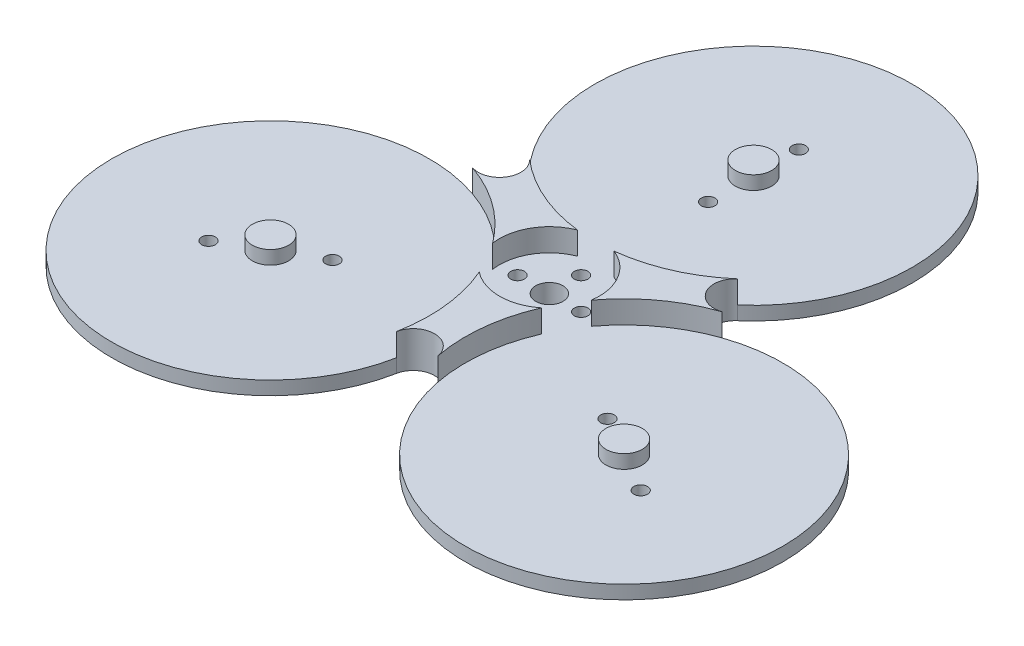
ISO-10303-21;
HEADER;
FILE_DESCRIPTION(('STEP AP214'),'2;1');
FILE_NAME('part.step','',(''),(''),'','','');
FILE_SCHEMA(('AUTOMOTIVE_DESIGN { 1 0 10303 214 1 1 1 1 }'));
ENDSEC;
DATA;
#1=APPLICATION_CONTEXT('core data for automotive mechanical design processes');
#2=APPLICATION_PROTOCOL_DEFINITION('international standard','automotive_design',2000,#1);
#3=PRODUCT_CONTEXT('',#1,'mechanical');
#4=PRODUCT('Part','Part','',(#3));
#5=PRODUCT_RELATED_PRODUCT_CATEGORY('part','',(#4));
#6=PRODUCT_DEFINITION_FORMATION('','',#4);
#7=PRODUCT_DEFINITION_CONTEXT('part definition',#1,'design');
#8=PRODUCT_DEFINITION('design','',#6,#7);
#9=PRODUCT_DEFINITION_SHAPE('','',#8);
#10=(LENGTH_UNIT() NAMED_UNIT(*) SI_UNIT(.MILLI.,.METRE.));
#11=(NAMED_UNIT(*) PLANE_ANGLE_UNIT() SI_UNIT($,.RADIAN.));
#12=(NAMED_UNIT(*) SI_UNIT($,.STERADIAN.) SOLID_ANGLE_UNIT());
#13=UNCERTAINTY_MEASURE_WITH_UNIT(LENGTH_MEASURE(1.E-05),#10,'distance_accuracy_value','');
#14=(GEOMETRIC_REPRESENTATION_CONTEXT(3) GLOBAL_UNCERTAINTY_ASSIGNED_CONTEXT((#13)) GLOBAL_UNIT_ASSIGNED_CONTEXT((#10,
#11,#12)) REPRESENTATION_CONTEXT('',''));
#15=CARTESIAN_POINT('',(0.,0.,0.));
#16=DIRECTION('',(0.,0.,1.));
#17=DIRECTION('',(1.,0.,0.));
#18=AXIS2_PLACEMENT_3D('',#15,#16,#17);
#19=CARTESIAN_POINT('',(5.759281940243E-13,3.,-44.9999999999999));
#20=DIRECTION('',(0.,1.,0.));
#21=DIRECTION('',(0.,0.,1.));
#22=AXIS2_PLACEMENT_3D('',#19,#20,#21);
#23=CYLINDRICAL_SURFACE('',#22,4.);
#24=CARTESIAN_POINT('',(5.759281940243E-13,3.,-44.9999999999999));
#25=DIRECTION('',(0.,1.,0.));
#26=DIRECTION('',(0.,0.,1.));
#27=AXIS2_PLACEMENT_3D('',#24,#25,#26);
#28=CIRCLE('',#27,4.);
#29=CARTESIAN_POINT('',(5.759281940243E-13,3.,-40.9999999999999));
#30=VERTEX_POINT('',#29);
#31=EDGE_CURVE('E240',#30,#30,#28,.T.);
#32=ORIENTED_EDGE('',*,*,#31,.T.);
#33=EDGE_LOOP('',(#32));
#34=FACE_BOUND('',#33,.T.);
#35=CARTESIAN_POINT('',(5.759281940243E-13,6.,-44.9999999999999));
#36=DIRECTION('',(0.,1.,0.));
#37=DIRECTION('',(0.,0.,1.));
#38=AXIS2_PLACEMENT_3D('',#35,#36,#37);
#39=CIRCLE('',#38,4.);
#40=CARTESIAN_POINT('',(5.759281940243E-13,6.,-40.9999999999999));
#41=VERTEX_POINT('',#40);
#42=EDGE_CURVE('E249',#41,#41,#39,.T.);
#43=ORIENTED_EDGE('',*,*,#42,.F.);
#44=EDGE_LOOP('',(#43));
#45=FACE_BOUND('',#44,.T.);
#46=ADVANCED_FACE('F99',(#34,#45),#23,.T.);
#47=CARTESIAN_POINT('',(38.9711431703026,3.,22.4999999999983));
#48=DIRECTION('',(0.,1.,0.));
#49=DIRECTION('',(0.,0.,1.));
#50=AXIS2_PLACEMENT_3D('',#47,#48,#49);
#51=CYLINDRICAL_SURFACE('',#50,4.00000000000301);
#52=CARTESIAN_POINT('',(38.9711431703026,3.,22.4999999999983));
#53=DIRECTION('',(0.,1.,0.));
#54=DIRECTION('',(0.,0.,1.));
#55=AXIS2_PLACEMENT_3D('',#52,#53,#54);
#56=CIRCLE('',#55,4.00000000000301);
#57=CARTESIAN_POINT('',(38.9711431703026,3.,26.5000000000013));
#58=VERTEX_POINT('',#57);
#59=EDGE_CURVE('E318',#58,#58,#56,.T.);
#60=ORIENTED_EDGE('',*,*,#59,.T.);
#61=EDGE_LOOP('',(#60));
#62=FACE_BOUND('',#61,.T.);
#63=CARTESIAN_POINT('',(38.9711431703026,6.,22.4999999999983));
#64=DIRECTION('',(0.,1.,0.));
#65=DIRECTION('',(0.,0.,1.));
#66=AXIS2_PLACEMENT_3D('',#63,#64,#65);
#67=CIRCLE('',#66,4.00000000000301);
#68=CARTESIAN_POINT('',(38.9711431703026,6.,26.5000000000013));
#69=VERTEX_POINT('',#68);
#70=EDGE_CURVE('E252',#69,#69,#67,.T.);
#71=ORIENTED_EDGE('',*,*,#70,.F.);
#72=EDGE_LOOP('',(#71));
#73=FACE_BOUND('',#72,.T.);
#74=ADVANCED_FACE('F354',(#62,#73),#51,.T.);
#75=CARTESIAN_POINT('',(-38.9711431702969,3.,22.5000000000017));
#76=DIRECTION('',(0.,1.,0.));
#77=DIRECTION('',(0.,0.,1.));
#78=AXIS2_PLACEMENT_3D('',#75,#76,#77);
#79=CYLINDRICAL_SURFACE('',#78,4.00000000000418);
#80=CARTESIAN_POINT('',(-38.9711431702969,3.,22.5000000000017));
#81=DIRECTION('',(0.,1.,0.));
#82=DIRECTION('',(0.,0.,1.));
#83=AXIS2_PLACEMENT_3D('',#80,#81,#82);
#84=CIRCLE('',#83,4.00000000000418);
#85=CARTESIAN_POINT('',(-38.9711431702969,3.,26.5000000000059));
#86=VERTEX_POINT('',#85);
#87=EDGE_CURVE('E286',#86,#86,#84,.T.);
#88=ORIENTED_EDGE('',*,*,#87,.T.);
#89=EDGE_LOOP('',(#88));
#90=FACE_BOUND('',#89,.T.);
#91=CARTESIAN_POINT('',(-38.9711431702969,6.,22.5000000000017));
#92=DIRECTION('',(0.,1.,0.));
#93=DIRECTION('',(0.,0.,1.));
#94=AXIS2_PLACEMENT_3D('',#91,#92,#93);
#95=CIRCLE('',#94,4.00000000000418);
#96=CARTESIAN_POINT('',(-38.9711431702969,6.,26.5000000000059));
#97=VERTEX_POINT('',#96);
#98=EDGE_CURVE('E255',#97,#97,#95,.T.);
#99=ORIENTED_EDGE('',*,*,#98,.F.);
#100=EDGE_LOOP('',(#99));
#101=FACE_BOUND('',#100,.T.);
#102=ADVANCED_FACE('F360',(#90,#101),#79,.T.);
#103=CARTESIAN_POINT('',(-12.9903810567665,8.,-30.));
#104=DIRECTION('',(0.,1.,0.));
#105=DIRECTION('',(0.,0.,1.));
#106=AXIS2_PLACEMENT_3D('',#103,#104,#105);
#107=PLANE('',#106);
#108=CARTESIAN_POINT('',(5.759281940243E-13,8.,-44.9999999999999));
#109=DIRECTION('',(0.,1.,0.));
#110=DIRECTION('',(0.,0.,1.));
#111=AXIS2_PLACEMENT_3D('',#108,#109,#110);
#112=CIRCLE('',#111,35.);
#113=CARTESIAN_POINT('',(-22.9128784747792,8.,-18.5424868893545));
#114=VERTEX_POINT('',#113);
#115=CARTESIAN_POINT('',(-4.03471050868448,8.,-10.2333333333333));
#116=VERTEX_POINT('',#115);
#117=EDGE_CURVE('E246',#114,#116,#112,.T.);
#118=ORIENTED_EDGE('',*,*,#117,.F.);
#119=CARTESIAN_POINT('',(-25.9807621135335,8.,-15.0000000000001));
#120=DIRECTION('',(0.,-1.,0.));
#121=DIRECTION('',(0.,0.,1.));
#122=AXIS2_PLACEMENT_3D('',#119,#120,#121);
#123=CIRCLE('',#122,4.68626966596892);
#124=CARTESIAN_POINT('',(-27.5147039329101,8.,-10.5718913883084));
#125=VERTEX_POINT('',#124);
#126=EDGE_CURVE('E462',#114,#125,#123,.T.);
#127=ORIENTED_EDGE('',*,*,#126,.T.);
#128=CARTESIAN_POINT('',(-38.9711431702997,8.,22.5));
#129=DIRECTION('',(0.,1.,0.));
#130=DIRECTION('',(0.,0.,1.));
#131=AXIS2_PLACEMENT_3D('',#128,#129,#130);
#132=CIRCLE('',#131,35.0000000000009);
#133=CARTESIAN_POINT('',(-10.8796818864033,8.,1.62250486922791));
#134=VERTEX_POINT('',#133);
#135=EDGE_CURVE('E281',#134,#125,#132,.T.);
#136=ORIENTED_EDGE('',*,*,#135,.F.);
#137=CARTESIAN_POINT('',(0.,8.,0.));
#138=DIRECTION('',(0.,1.,0.));
#139=DIRECTION('',(0.,0.,1.));
#140=AXIS2_PLACEMENT_3D('',#137,#138,#139);
#141=CIRCLE('',#140,11.);
#142=EDGE_CURVE('E257',#116,#134,#141,.T.);
#143=ORIENTED_EDGE('',*,*,#142,.F.);
#144=EDGE_LOOP('',(#118,#127,#136,#143));
#145=FACE_BOUND('',#144,.T.);
#146=ADVANCED_FACE('F380',(#145),#107,.T.);
#147=CARTESIAN_POINT('',(4.03471050868474,8.,-10.2333333333332));
#148=VERTEX_POINT('',#147);
#149=CARTESIAN_POINT('',(22.9128784747795,8.,-18.5424868893538));
#150=VERTEX_POINT('',#149);
#151=EDGE_CURVE('E243',#148,#150,#112,.T.);
#152=ORIENTED_EDGE('',*,*,#151,.F.);
#153=CARTESIAN_POINT('',(10.8796818864032,8.,1.62250486922836));
#154=VERTEX_POINT('',#153);
#155=EDGE_CURVE('E216',#154,#148,#141,.T.);
#156=ORIENTED_EDGE('',*,*,#155,.F.);
#157=CARTESIAN_POINT('',(38.9711431702998,8.,22.5));
#158=DIRECTION('',(0.,1.,0.));
#159=DIRECTION('',(0.,0.,1.));
#160=AXIS2_PLACEMENT_3D('',#157,#158,#159);
#161=CIRCLE('',#160,35.0000000000007);
#162=CARTESIAN_POINT('',(27.5147039329099,8.,-10.5718913883081));
#163=VERTEX_POINT('',#162);
#164=EDGE_CURVE('E292',#163,#154,#161,.T.);
#165=ORIENTED_EDGE('',*,*,#164,.F.);
#166=CARTESIAN_POINT('',(25.9807621135332,8.,-14.9999999999999));
#167=DIRECTION('',(0.,-1.,0.));
#168=DIRECTION('',(0.,0.,1.));
#169=AXIS2_PLACEMENT_3D('',#166,#167,#168);
#170=CIRCLE('',#169,4.68626966596894);
#171=EDGE_CURVE('E478',#163,#150,#170,.T.);
#172=ORIENTED_EDGE('',*,*,#171,.T.);
#173=EDGE_LOOP('',(#152,#156,#165,#172));
#174=FACE_BOUND('',#173,.T.);
#175=ADVANCED_FACE('F563',(#174),#107,.T.);
#176=CARTESIAN_POINT('',(-38.9711431702999,8.,22.4999999999997));
#177=DIRECTION('',(0.,-1.,0.));
#178=DIRECTION('',(0.,0.,-1.));
#179=AXIS2_PLACEMENT_3D('',#176,#177,#178);
#180=CYLINDRICAL_SURFACE('',#179,35.0000000000002);
#181=CARTESIAN_POINT('',(-38.9711431702997,3.,22.5));
#182=DIRECTION('',(0.,1.,0.));
#183=DIRECTION('',(0.,0.,1.));
#184=AXIS2_PLACEMENT_3D('',#181,#182,#183);
#185=CIRCLE('',#184,35.0000000000009);
#186=CARTESIAN_POINT('',(-27.5147039329101,3.,-10.5718913883084));
#187=VERTEX_POINT('',#186);
#188=CARTESIAN_POINT('',(-4.60182545813007,3.,29.114378277662));
#189=VERTEX_POINT('',#188);
#190=EDGE_CURVE('E305',#187,#189,#185,.T.);
#191=ORIENTED_EDGE('',*,*,#190,.F.);
#192=DIRECTION('',(0.,-1.,0.));
#193=VECTOR('',#192,1.);
#194=CARTESIAN_POINT('',(-27.5147039329108,8.,-10.5718913883064));
#195=LINE('',#194,#193);
#196=CARTESIAN_POINT('',(-27.5147039329108,0.,-10.5718913883064));
#197=VERTEX_POINT('',#196);
#198=EDGE_CURVE('E447',#187,#197,#195,.T.);
#199=ORIENTED_EDGE('',*,*,#198,.T.);
#200=CARTESIAN_POINT('',(-38.9711431702999,0.,22.4999999999997));
#201=DIRECTION('',(0.,1.,0.));
#202=DIRECTION('',(0.,0.,1.));
#203=AXIS2_PLACEMENT_3D('',#200,#201,#202);
#204=CIRCLE('',#203,35.0000000000002);
#205=CARTESIAN_POINT('',(-4.60182545813127,0.,29.1143782776618));
#206=VERTEX_POINT('',#205);
#207=EDGE_CURVE('E471',#197,#206,#204,.T.);
#208=ORIENTED_EDGE('',*,*,#207,.T.);
#209=DIRECTION('',(0.,-1.,0.));
#210=VECTOR('',#209,1.);
#211=CARTESIAN_POINT('',(-4.60182545813127,8.,29.1143782776618));
#212=LINE('',#211,#210);
#213=EDGE_CURVE('E451',#189,#206,#212,.T.);
#214=ORIENTED_EDGE('',*,*,#213,.F.);
#215=EDGE_LOOP('',(#191,#199,#208,#214));
#216=FACE_BOUND('',#215,.T.);
#217=ADVANCED_FACE('F576',(#216),#180,.T.);
#218=CARTESIAN_POINT('',(38.9711431702996,8.,22.5000000000002));
#219=DIRECTION('',(0.,-1.,0.));
#220=DIRECTION('',(0.,0.,-1.));
#221=AXIS2_PLACEMENT_3D('',#218,#219,#220);
#222=CYLINDRICAL_SURFACE('',#221,35.);
#223=CARTESIAN_POINT('',(38.9711431702998,3.,22.5));
#224=DIRECTION('',(0.,1.,0.));
#225=DIRECTION('',(0.,0.,1.));
#226=AXIS2_PLACEMENT_3D('',#223,#224,#225);
#227=CIRCLE('',#226,35.0000000000007);
#228=CARTESIAN_POINT('',(4.60182545813028,3.,29.1143782776619));
#229=VERTEX_POINT('',#228);
#230=CARTESIAN_POINT('',(27.5147039329099,3.,-10.5718913883081));
#231=VERTEX_POINT('',#230);
#232=EDGE_CURVE('E326',#229,#231,#227,.T.);
#233=ORIENTED_EDGE('',*,*,#232,.F.);
#234=DIRECTION('',(0.,-1.,0.));
#235=VECTOR('',#234,1.);
#236=CARTESIAN_POINT('',(4.60182545813083,8.,29.1143782776618));
#237=LINE('',#236,#235);
#238=CARTESIAN_POINT('',(4.60182545813083,0.,29.1143782776618));
#239=VERTEX_POINT('',#238);
#240=EDGE_CURVE('E454',#229,#239,#237,.T.);
#241=ORIENTED_EDGE('',*,*,#240,.T.);
#242=CARTESIAN_POINT('',(38.9711431702996,0.,22.5000000000002));
#243=DIRECTION('',(0.,1.,0.));
#244=DIRECTION('',(0.,0.,1.));
#245=AXIS2_PLACEMENT_3D('',#242,#243,#244);
#246=CIRCLE('',#245,35.);
#247=CARTESIAN_POINT('',(27.5147039329102,0.,-10.5718913883072));
#248=VERTEX_POINT('',#247);
#249=EDGE_CURVE('E465',#239,#248,#246,.T.);
#250=ORIENTED_EDGE('',*,*,#249,.T.);
#251=DIRECTION('',(0.,-1.,0.));
#252=VECTOR('',#251,1.);
#253=CARTESIAN_POINT('',(27.5147039329102,8.,-10.5718913883072));
#254=LINE('',#253,#252);
#255=EDGE_CURVE('E458',#231,#248,#254,.T.);
#256=ORIENTED_EDGE('',*,*,#255,.F.);
#257=EDGE_LOOP('',(#233,#241,#250,#256));
#258=FACE_BOUND('',#257,.T.);
#259=ADVANCED_FACE('F569',(#258),#222,.T.);
#260=CARTESIAN_POINT('',(0.,8.,-45.));
#261=DIRECTION('',(0.,-1.,0.));
#262=DIRECTION('',(0.,0.,-1.));
#263=AXIS2_PLACEMENT_3D('',#260,#261,#262);
#264=CYLINDRICAL_SURFACE('',#263,35.);
#265=CARTESIAN_POINT('',(5.759281940243E-13,3.,-44.9999999999999));
#266=DIRECTION('',(0.,1.,0.));
#267=DIRECTION('',(0.,0.,1.));
#268=AXIS2_PLACEMENT_3D('',#265,#266,#267);
#269=CIRCLE('',#268,35.);
#270=CARTESIAN_POINT('',(22.9128784747792,3.,-18.5424868893541));
#271=VERTEX_POINT('',#270);
#272=CARTESIAN_POINT('',(-22.9128784747792,3.,-18.5424868893545));
#273=VERTEX_POINT('',#272);
#274=EDGE_CURVE('E234',#271,#273,#269,.T.);
#275=ORIENTED_EDGE('',*,*,#274,.F.);
#276=DIRECTION('',(0.,-1.,0.));
#277=VECTOR('',#276,1.);
#278=CARTESIAN_POINT('',(22.9128784747792,8.,-18.5424868893541));
#279=LINE('',#278,#277);
#280=CARTESIAN_POINT('',(22.9128784747792,0.,-18.5424868893541));
#281=VERTEX_POINT('',#280);
#282=EDGE_CURVE('E123',#271,#281,#279,.T.);
#283=ORIENTED_EDGE('',*,*,#282,.T.);
#284=CARTESIAN_POINT('',(0.,0.,-45.));
#285=DIRECTION('',(0.,1.,0.));
#286=DIRECTION('',(0.,0.,-1.));
#287=AXIS2_PLACEMENT_3D('',#284,#285,#286);
#288=CIRCLE('',#287,35.);
#289=CARTESIAN_POINT('',(-22.9128784747795,0.,-18.5424868893542));
#290=VERTEX_POINT('',#289);
#291=EDGE_CURVE('E460',#281,#290,#288,.T.);
#292=ORIENTED_EDGE('',*,*,#291,.T.);
#293=DIRECTION('',(0.,-1.,0.));
#294=VECTOR('',#293,1.);
#295=CARTESIAN_POINT('',(-22.9128784747795,8.,-18.5424868893542));
#296=LINE('',#295,#294);
#297=EDGE_CURVE('E442',#273,#290,#296,.T.);
#298=ORIENTED_EDGE('',*,*,#297,.F.);
#299=EDGE_LOOP('',(#275,#283,#292,#298));
#300=FACE_BOUND('',#299,.T.);
#301=ADVANCED_FACE('F556',(#300),#264,.T.);
#302=CARTESIAN_POINT('',(0.,8.,0.));
#303=DIRECTION('',(0.,-1.,0.));
#304=DIRECTION('',(0.,0.,-1.));
#305=AXIS2_PLACEMENT_3D('',#302,#303,#304);
#306=CYLINDRICAL_SURFACE('',#305,3.);
#307=CARTESIAN_POINT('',(0.,-8.,0.));
#308=DIRECTION('',(0.,-1.,0.));
#309=DIRECTION('',(0.,0.,-1.));
#310=AXIS2_PLACEMENT_3D('',#307,#308,#309);
#311=CIRCLE('',#310,3.);
#312=CARTESIAN_POINT('',(0.,-8.,-3.));
#313=VERTEX_POINT('',#312);
#314=EDGE_CURVE('E516',#313,#313,#311,.T.);
#315=ORIENTED_EDGE('',*,*,#314,.T.);
#316=EDGE_LOOP('',(#315));
#317=FACE_BOUND('',#316,.T.);
#318=CARTESIAN_POINT('',(0.,3.,0.));
#319=DIRECTION('',(0.,1.,0.));
#320=DIRECTION('',(0.,0.,1.));
#321=AXIS2_PLACEMENT_3D('',#318,#319,#320);
#322=CIRCLE('',#321,3.);
#323=CARTESIAN_POINT('',(0.,3.,3.));
#324=VERTEX_POINT('',#323);
#325=EDGE_CURVE('E519',#324,#324,#322,.T.);
#326=ORIENTED_EDGE('',*,*,#325,.T.);
#327=EDGE_LOOP('',(#326));
#328=FACE_BOUND('',#327,.T.);
#329=ADVANCED_FACE('F552',(#317,#328),#306,.F.);
#330=CARTESIAN_POINT('',(0.,8.,-7.));
#331=DIRECTION('',(0.,-1.,0.));
#332=DIRECTION('',(0.,0.,-1.));
#333=AXIS2_PLACEMENT_3D('',#330,#331,#332);
#334=CYLINDRICAL_SURFACE('',#333,1.5);
#335=CARTESIAN_POINT('',(0.,-8.,-7.));
#336=DIRECTION('',(0.,-1.,0.));
#337=DIRECTION('',(0.,0.,-1.));
#338=AXIS2_PLACEMENT_3D('',#335,#336,#337);
#339=CIRCLE('',#338,1.5);
#340=CARTESIAN_POINT('',(0.,-8.,-8.5));
#341=VERTEX_POINT('',#340);
#342=EDGE_CURVE('E507',#341,#341,#339,.T.);
#343=ORIENTED_EDGE('',*,*,#342,.T.);
#344=EDGE_LOOP('',(#343));
#345=FACE_BOUND('',#344,.T.);
#346=CARTESIAN_POINT('',(0.,3.,-7.));
#347=DIRECTION('',(0.,1.,0.));
#348=DIRECTION('',(0.,0.,1.));
#349=AXIS2_PLACEMENT_3D('',#346,#347,#348);
#350=CIRCLE('',#349,1.5);
#351=CARTESIAN_POINT('',(0.,3.,-5.5));
#352=VERTEX_POINT('',#351);
#353=EDGE_CURVE('E522',#352,#352,#350,.T.);
#354=ORIENTED_EDGE('',*,*,#353,.T.);
#355=EDGE_LOOP('',(#354));
#356=FACE_BOUND('',#355,.T.);
#357=ADVANCED_FACE('F548',(#345,#356),#334,.F.);
#358=CARTESIAN_POINT('',(7.,8.,0.));
#359=DIRECTION('',(0.,-1.,0.));
#360=DIRECTION('',(0.,0.,-1.));
#361=AXIS2_PLACEMENT_3D('',#358,#359,#360);
#362=CYLINDRICAL_SURFACE('',#361,1.5);
#363=CARTESIAN_POINT('',(7.,-8.,0.));
#364=DIRECTION('',(0.,-1.,0.));
#365=DIRECTION('',(0.,0.,-1.));
#366=AXIS2_PLACEMENT_3D('',#363,#364,#365);
#367=CIRCLE('',#366,1.5);
#368=CARTESIAN_POINT('',(7.,-8.,-1.49999999999998));
#369=VERTEX_POINT('',#368);
#370=EDGE_CURVE('E510',#369,#369,#367,.T.);
#371=ORIENTED_EDGE('',*,*,#370,.T.);
#372=EDGE_LOOP('',(#371));
#373=FACE_BOUND('',#372,.T.);
#374=CARTESIAN_POINT('',(7.,3.,0.));
#375=DIRECTION('',(0.,1.,0.));
#376=DIRECTION('',(0.,0.,1.));
#377=AXIS2_PLACEMENT_3D('',#374,#375,#376);
#378=CIRCLE('',#377,1.5);
#379=CARTESIAN_POINT('',(7.,3.,1.50000000000002));
#380=VERTEX_POINT('',#379);
#381=EDGE_CURVE('E525',#380,#380,#378,.T.);
#382=ORIENTED_EDGE('',*,*,#381,.T.);
#383=EDGE_LOOP('',(#382));
#384=FACE_BOUND('',#383,.T.);
#385=ADVANCED_FACE('F542',(#373,#384),#362,.F.);
#386=CARTESIAN_POINT('',(0.,8.,7.));
#387=DIRECTION('',(0.,-1.,0.));
#388=DIRECTION('',(0.,0.,-1.));
#389=AXIS2_PLACEMENT_3D('',#386,#387,#388);
#390=CYLINDRICAL_SURFACE('',#389,1.5);
#391=CARTESIAN_POINT('',(0.,-8.,7.));
#392=DIRECTION('',(0.,-1.,0.));
#393=DIRECTION('',(0.,0.,-1.));
#394=AXIS2_PLACEMENT_3D('',#391,#392,#393);
#395=CIRCLE('',#394,1.5);
#396=CARTESIAN_POINT('',(0.,-8.,5.5));
#397=VERTEX_POINT('',#396);
#398=EDGE_CURVE('E513',#397,#397,#395,.T.);
#399=ORIENTED_EDGE('',*,*,#398,.T.);
#400=EDGE_LOOP('',(#399));
#401=FACE_BOUND('',#400,.T.);
#402=CARTESIAN_POINT('',(0.,3.,7.));
#403=DIRECTION('',(0.,1.,0.));
#404=DIRECTION('',(0.,0.,1.));
#405=AXIS2_PLACEMENT_3D('',#402,#403,#404);
#406=CIRCLE('',#405,1.5);
#407=CARTESIAN_POINT('',(0.,3.,8.5));
#408=VERTEX_POINT('',#407);
#409=EDGE_CURVE('E528',#408,#408,#406,.T.);
#410=ORIENTED_EDGE('',*,*,#409,.T.);
#411=EDGE_LOOP('',(#410));
#412=FACE_BOUND('',#411,.T.);
#413=ADVANCED_FACE('F536',(#401,#412),#390,.F.);
#414=CARTESIAN_POINT('',(-7.,8.,0.));
#415=DIRECTION('',(0.,-1.,0.));
#416=DIRECTION('',(0.,0.,-1.));
#417=AXIS2_PLACEMENT_3D('',#414,#415,#416);
#418=CYLINDRICAL_SURFACE('',#417,1.5);
#419=CARTESIAN_POINT('',(-7.,-8.,0.));
#420=DIRECTION('',(0.,-1.,0.));
#421=DIRECTION('',(0.,0.,-1.));
#422=AXIS2_PLACEMENT_3D('',#419,#420,#421);
#423=CIRCLE('',#422,1.5);
#424=CARTESIAN_POINT('',(-7.,-8.,-1.50000000000007));
#425=VERTEX_POINT('',#424);
#426=EDGE_CURVE('E504',#425,#425,#423,.T.);
#427=ORIENTED_EDGE('',*,*,#426,.T.);
#428=EDGE_LOOP('',(#427));
#429=FACE_BOUND('',#428,.T.);
#430=CARTESIAN_POINT('',(-7.,3.,0.));
#431=DIRECTION('',(0.,1.,0.));
#432=DIRECTION('',(0.,0.,1.));
#433=AXIS2_PLACEMENT_3D('',#430,#431,#432);
#434=CIRCLE('',#433,1.5);
#435=CARTESIAN_POINT('',(-7.,3.,1.49999999999993));
#436=VERTEX_POINT('',#435);
#437=EDGE_CURVE('E329',#436,#436,#434,.T.);
#438=ORIENTED_EDGE('',*,*,#437,.T.);
#439=EDGE_LOOP('',(#438));
#440=FACE_BOUND('',#439,.T.);
#441=ADVANCED_FACE('F349',(#429,#440),#418,.F.);
#442=CARTESIAN_POINT('',(0.,8.,-55.));
#443=DIRECTION('',(0.,-1.,0.));
#444=DIRECTION('',(0.,0.,-1.));
#445=AXIS2_PLACEMENT_3D('',#442,#443,#444);
#446=CYLINDRICAL_SURFACE('',#445,1.5);
#447=CARTESIAN_POINT('',(0.,0.,-55.));
#448=DIRECTION('',(0.,1.,0.));
#449=DIRECTION('',(0.,0.,1.));
#450=AXIS2_PLACEMENT_3D('',#447,#448,#449);
#451=CIRCLE('',#450,1.5);
#452=CARTESIAN_POINT('',(0.,0.,-53.5));
#453=VERTEX_POINT('',#452);
#454=EDGE_CURVE('E477',#453,#453,#451,.T.);
#455=ORIENTED_EDGE('',*,*,#454,.F.);
#456=EDGE_LOOP('',(#455));
#457=FACE_BOUND('',#456,.T.);
#458=CARTESIAN_POINT('',(0.,3.,-55.));
#459=DIRECTION('',(0.,1.,0.));
#460=DIRECTION('',(0.,0.,1.));
#461=AXIS2_PLACEMENT_3D('',#458,#459,#460);
#462=CIRCLE('',#461,1.5);
#463=CARTESIAN_POINT('',(0.,3.,-53.5));
#464=VERTEX_POINT('',#463);
#465=EDGE_CURVE('E233',#464,#464,#462,.F.);
#466=ORIENTED_EDGE('',*,*,#465,.F.);
#467=EDGE_LOOP('',(#466));
#468=FACE_BOUND('',#467,.T.);
#469=ADVANCED_FACE('F339',(#457,#468),#446,.F.);
#470=CARTESIAN_POINT('',(0.,8.,-35.));
#471=DIRECTION('',(0.,-1.,0.));
#472=DIRECTION('',(0.,0.,-1.));
#473=AXIS2_PLACEMENT_3D('',#470,#471,#472);
#474=CYLINDRICAL_SURFACE('',#473,1.5);
#475=CARTESIAN_POINT('',(0.,0.,-35.));
#476=DIRECTION('',(0.,1.,0.));
#477=DIRECTION('',(0.,0.,1.));
#478=AXIS2_PLACEMENT_3D('',#475,#476,#477);
#479=CIRCLE('',#478,1.5);
#480=CARTESIAN_POINT('',(0.,0.,-33.5));
#481=VERTEX_POINT('',#480);
#482=EDGE_CURVE('E488',#481,#481,#479,.T.);
#483=ORIENTED_EDGE('',*,*,#482,.F.);
#484=EDGE_LOOP('',(#483));
#485=FACE_BOUND('',#484,.T.);
#486=CARTESIAN_POINT('',(0.,3.,-35.));
#487=DIRECTION('',(0.,1.,0.));
#488=DIRECTION('',(0.,0.,1.));
#489=AXIS2_PLACEMENT_3D('',#486,#487,#488);
#490=CIRCLE('',#489,1.5);
#491=CARTESIAN_POINT('',(0.,3.,-33.5));
#492=VERTEX_POINT('',#491);
#493=EDGE_CURVE('E220',#492,#492,#490,.F.);
#494=ORIENTED_EDGE('',*,*,#493,.F.);
#495=EDGE_LOOP('',(#494));
#496=FACE_BOUND('',#495,.T.);
#497=ADVANCED_FACE('F336',(#485,#496),#474,.F.);
#498=CARTESIAN_POINT('',(47.6313972081464,8.,27.4999999999987));
#499=DIRECTION('',(0.,-1.,0.));
#500=DIRECTION('',(0.,0.,-1.));
#501=AXIS2_PLACEMENT_3D('',#498,#499,#500);
#502=CYLINDRICAL_SURFACE('',#501,1.50000000000202);
#503=CARTESIAN_POINT('',(47.6313972081464,0.,27.4999999999987));
#504=DIRECTION('',(0.,1.,0.));
#505=DIRECTION('',(0.,0.,1.));
#506=AXIS2_PLACEMENT_3D('',#503,#504,#505);
#507=CIRCLE('',#506,1.50000000000202);
#508=CARTESIAN_POINT('',(47.6313972081464,0.,29.0000000000007));
#509=VERTEX_POINT('',#508);
#510=EDGE_CURVE('E491',#509,#509,#507,.T.);
#511=ORIENTED_EDGE('',*,*,#510,.F.);
#512=EDGE_LOOP('',(#511));
#513=FACE_BOUND('',#512,.T.);
#514=CARTESIAN_POINT('',(47.6313972081464,3.,27.4999999999987));
#515=DIRECTION('',(0.,1.,0.));
#516=DIRECTION('',(0.,0.,1.));
#517=AXIS2_PLACEMENT_3D('',#514,#515,#516);
#518=CIRCLE('',#517,1.50000000000202);
#519=CARTESIAN_POINT('',(47.6313972081464,3.,29.0000000000007));
#520=VERTEX_POINT('',#519);
#521=EDGE_CURVE('E314',#520,#520,#518,.F.);
#522=ORIENTED_EDGE('',*,*,#521,.F.);
#523=EDGE_LOOP('',(#522));
#524=FACE_BOUND('',#523,.T.);
#525=ADVANCED_FACE('F338',(#513,#524),#502,.F.);
#526=CARTESIAN_POINT('',(30.3108891324576,8.,17.4999999999987));
#527=DIRECTION('',(0.,-1.,0.));
#528=DIRECTION('',(0.,0.,-1.));
#529=AXIS2_PLACEMENT_3D('',#526,#527,#528);
#530=CYLINDRICAL_SURFACE('',#529,1.50000000000191);
#531=CARTESIAN_POINT('',(30.3108891324576,0.,17.4999999999987));
#532=DIRECTION('',(0.,1.,0.));
#533=DIRECTION('',(0.,0.,1.));
#534=AXIS2_PLACEMENT_3D('',#531,#532,#533);
#535=CIRCLE('',#534,1.50000000000191);
#536=CARTESIAN_POINT('',(30.3108891324576,0.,19.0000000000006));
#537=VERTEX_POINT('',#536);
#538=EDGE_CURVE('E410',#537,#537,#535,.T.);
#539=ORIENTED_EDGE('',*,*,#538,.F.);
#540=EDGE_LOOP('',(#539));
#541=FACE_BOUND('',#540,.T.);
#542=CARTESIAN_POINT('',(30.3108891324576,3.,17.4999999999987));
#543=DIRECTION('',(0.,1.,0.));
#544=DIRECTION('',(0.,0.,1.));
#545=AXIS2_PLACEMENT_3D('',#542,#543,#544);
#546=CIRCLE('',#545,1.50000000000191);
#547=CARTESIAN_POINT('',(30.3108891324576,3.,19.0000000000006));
#548=VERTEX_POINT('',#547);
#549=EDGE_CURVE('E321',#548,#548,#546,.F.);
#550=ORIENTED_EDGE('',*,*,#549,.F.);
#551=EDGE_LOOP('',(#550));
#552=FACE_BOUND('',#551,.T.);
#553=ADVANCED_FACE('F346',(#541,#552),#530,.F.);
#554=CARTESIAN_POINT('',(-47.6313972081419,8.,27.5000000000013));
#555=DIRECTION('',(0.,-1.,0.));
#556=DIRECTION('',(0.,0.,-1.));
#557=AXIS2_PLACEMENT_3D('',#554,#555,#556);
#558=CYLINDRICAL_SURFACE('',#557,1.50000000000301);
#559=CARTESIAN_POINT('',(-47.6313972081419,0.,27.5000000000013));
#560=DIRECTION('',(0.,1.,0.));
#561=DIRECTION('',(0.,0.,1.));
#562=AXIS2_PLACEMENT_3D('',#559,#560,#561);
#563=CIRCLE('',#562,1.50000000000301);
#564=CARTESIAN_POINT('',(-47.6313972081419,0.,29.0000000000043));
#565=VERTEX_POINT('',#564);
#566=EDGE_CURVE('E495',#565,#565,#563,.T.);
#567=ORIENTED_EDGE('',*,*,#566,.F.);
#568=EDGE_LOOP('',(#567));
#569=FACE_BOUND('',#568,.T.);
#570=CARTESIAN_POINT('',(-47.6313972081419,3.,27.5000000000013));
#571=DIRECTION('',(0.,1.,0.));
#572=DIRECTION('',(0.,0.,1.));
#573=AXIS2_PLACEMENT_3D('',#570,#571,#572);
#574=CIRCLE('',#573,1.50000000000301);
#575=CARTESIAN_POINT('',(-47.6313972081419,3.,29.0000000000043));
#576=VERTEX_POINT('',#575);
#577=EDGE_CURVE('E298',#576,#576,#574,.F.);
#578=ORIENTED_EDGE('',*,*,#577,.F.);
#579=EDGE_LOOP('',(#578));
#580=FACE_BOUND('',#579,.T.);
#581=ADVANCED_FACE('F398',(#569,#580),#558,.F.);
#582=CARTESIAN_POINT('',(-30.3108891324531,8.,17.5000000000013));
#583=DIRECTION('',(0.,-1.,0.));
#584=DIRECTION('',(0.,0.,-1.));
#585=AXIS2_PLACEMENT_3D('',#582,#583,#584);
#586=CYLINDRICAL_SURFACE('',#585,1.50000000000282);
#587=CARTESIAN_POINT('',(-30.3108891324531,0.,17.5000000000013));
#588=DIRECTION('',(0.,1.,0.));
#589=DIRECTION('',(0.,0.,1.));
#590=AXIS2_PLACEMENT_3D('',#587,#588,#589);
#591=CIRCLE('',#590,1.50000000000282);
#592=CARTESIAN_POINT('',(-30.3108891324531,0.,19.0000000000041));
#593=VERTEX_POINT('',#592);
#594=EDGE_CURVE('E498',#593,#593,#591,.T.);
#595=ORIENTED_EDGE('',*,*,#594,.F.);
#596=EDGE_LOOP('',(#595));
#597=FACE_BOUND('',#596,.T.);
#598=CARTESIAN_POINT('',(-30.3108891324531,3.,17.5000000000013));
#599=DIRECTION('',(0.,1.,0.));
#600=DIRECTION('',(0.,0.,1.));
#601=AXIS2_PLACEMENT_3D('',#598,#599,#600);
#602=CIRCLE('',#601,1.50000000000282);
#603=CARTESIAN_POINT('',(-30.3108891324531,3.,19.0000000000041));
#604=VERTEX_POINT('',#603);
#605=EDGE_CURVE('E289',#604,#604,#602,.F.);
#606=ORIENTED_EDGE('',*,*,#605,.F.);
#607=EDGE_LOOP('',(#606));
#608=FACE_BOUND('',#607,.T.);
#609=ADVANCED_FACE('F394',(#597,#608),#586,.F.);
#610=CARTESIAN_POINT('',(-12.9903810567665,0.,-30.));
#611=DIRECTION('',(0.,1.,0.));
#612=DIRECTION('',(0.,0.,1.));
#613=AXIS2_PLACEMENT_3D('',#610,#611,#612);
#614=PLANE('',#613);
#615=CARTESIAN_POINT('',(0.,0.,0.));
#616=DIRECTION('',(0.,1.,0.));
#617=DIRECTION('',(0.,0.,1.));
#618=AXIS2_PLACEMENT_3D('',#615,#616,#617);
#619=CIRCLE('',#618,13.);
#620=CARTESIAN_POINT('',(0.,0.,13.));
#621=VERTEX_POINT('',#620);
#622=EDGE_CURVE('E12',#621,#621,#619,.T.);
#623=ORIENTED_EDGE('',*,*,#622,.T.);
#624=EDGE_LOOP('',(#623));
#625=FACE_BOUND('',#624,.T.);
#626=ORIENTED_EDGE('',*,*,#594,.T.);
#627=EDGE_LOOP('',(#626));
#628=FACE_BOUND('',#627,.T.);
#629=ORIENTED_EDGE('',*,*,#566,.T.);
#630=EDGE_LOOP('',(#629));
#631=FACE_BOUND('',#630,.T.);
#632=ORIENTED_EDGE('',*,*,#538,.T.);
#633=EDGE_LOOP('',(#632));
#634=FACE_BOUND('',#633,.T.);
#635=ORIENTED_EDGE('',*,*,#510,.T.);
#636=EDGE_LOOP('',(#635));
#637=FACE_BOUND('',#636,.T.);
#638=ORIENTED_EDGE('',*,*,#482,.T.);
#639=EDGE_LOOP('',(#638));
#640=FACE_BOUND('',#639,.T.);
#641=ORIENTED_EDGE('',*,*,#454,.T.);
#642=EDGE_LOOP('',(#641));
#643=FACE_BOUND('',#642,.T.);
#644=CARTESIAN_POINT('',(-25.9807621135335,0.,-15.0000000000001));
#645=DIRECTION('',(0.,-1.,0.));
#646=DIRECTION('',(0.,0.,1.));
#647=AXIS2_PLACEMENT_3D('',#644,#645,#646);
#648=CIRCLE('',#647,4.68626966596892);
#649=EDGE_CURVE('E474',#290,#197,#648,.T.);
#650=ORIENTED_EDGE('',*,*,#649,.F.);
#651=ORIENTED_EDGE('',*,*,#291,.F.);
#652=CARTESIAN_POINT('',(25.9807621135332,0.,-14.9999999999999));
#653=DIRECTION('',(0.,-1.,0.));
#654=DIRECTION('',(0.,0.,1.));
#655=AXIS2_PLACEMENT_3D('',#652,#653,#654);
#656=CIRCLE('',#655,4.68626966596894);
#657=EDGE_CURVE('E463',#248,#281,#656,.T.);
#658=ORIENTED_EDGE('',*,*,#657,.F.);
#659=ORIENTED_EDGE('',*,*,#249,.F.);
#660=CARTESIAN_POINT('',(-2.80112217342766E-13,0.,30.0000000000004));
#661=DIRECTION('',(0.,-1.,0.));
#662=DIRECTION('',(0.,0.,1.));
#663=AXIS2_PLACEMENT_3D('',#660,#661,#662);
#664=CIRCLE('',#663,4.68626966596892);
#665=EDGE_CURVE('E468',#206,#239,#664,.T.);
#666=ORIENTED_EDGE('',*,*,#665,.F.);
#667=ORIENTED_EDGE('',*,*,#207,.F.);
#668=EDGE_LOOP('',(#650,#651,#658,#659,#666,#667));
#669=FACE_BOUND('',#668,.T.);
#670=ADVANCED_FACE('F397',(#625,#628,#631,#634,#637,#640,#643,#669),#614,.F.);
#671=CARTESIAN_POINT('',(6.84497137771732,8.,8.61082846410441));
#672=VERTEX_POINT('',#671);
#673=CARTESIAN_POINT('',(4.60182545813028,8.,29.1143782776619));
#674=VERTEX_POINT('',#673);
#675=EDGE_CURVE('E316',#672,#674,#161,.T.);
#676=ORIENTED_EDGE('',*,*,#675,.F.);
#677=CARTESIAN_POINT('',(-6.84497137771695,8.,8.6108284641047));
#678=VERTEX_POINT('',#677);
#679=EDGE_CURVE('E261',#678,#672,#141,.T.);
#680=ORIENTED_EDGE('',*,*,#679,.F.);
#681=CARTESIAN_POINT('',(-4.60182545813007,8.,29.114378277662));
#682=VERTEX_POINT('',#681);
#683=EDGE_CURVE('E277',#682,#678,#132,.T.);
#684=ORIENTED_EDGE('',*,*,#683,.F.);
#685=CARTESIAN_POINT('',(-2.80112217342766E-13,8.,30.0000000000004));
#686=DIRECTION('',(0.,-1.,0.));
#687=DIRECTION('',(0.,0.,1.));
#688=AXIS2_PLACEMENT_3D('',#685,#686,#687);
#689=CIRCLE('',#688,4.68626966596892);
#690=EDGE_CURVE('E481',#682,#674,#689,.T.);
#691=ORIENTED_EDGE('',*,*,#690,.T.);
#692=EDGE_LOOP('',(#676,#680,#684,#691));
#693=FACE_BOUND('',#692,.T.);
#694=ADVANCED_FACE('F558',(#693),#107,.T.);
#695=CARTESIAN_POINT('',(-25.9807621135335,8.,-15.0000000000001));
#696=DIRECTION('',(0.,-1.,0.));
#697=DIRECTION('',(0.,0.,-1.));
#698=AXIS2_PLACEMENT_3D('',#695,#696,#697);
#699=CYLINDRICAL_SURFACE('',#698,4.68626966596892);
#700=ORIENTED_EDGE('',*,*,#649,.T.);
#701=ORIENTED_EDGE('',*,*,#198,.F.);
#702=EDGE_CURVE('E445',#125,#187,#195,.T.);
#703=ORIENTED_EDGE('',*,*,#702,.F.);
#704=ORIENTED_EDGE('',*,*,#126,.F.);
#705=EDGE_CURVE('E440',#114,#273,#296,.T.);
#706=ORIENTED_EDGE('',*,*,#705,.T.);
#707=ORIENTED_EDGE('',*,*,#297,.T.);
#708=EDGE_LOOP('',(#700,#701,#703,#704,#706,#707));
#709=FACE_BOUND('',#708,.T.);
#710=ADVANCED_FACE('F561',(#709),#699,.F.);
#711=CARTESIAN_POINT('',(-2.80112217342766E-13,8.,30.0000000000004));
#712=DIRECTION('',(0.,-1.,0.));
#713=DIRECTION('',(0.,0.,-1.));
#714=AXIS2_PLACEMENT_3D('',#711,#712,#713);
#715=CYLINDRICAL_SURFACE('',#714,4.68626966596892);
#716=ORIENTED_EDGE('',*,*,#665,.T.);
#717=ORIENTED_EDGE('',*,*,#240,.F.);
#718=EDGE_CURVE('E452',#674,#229,#237,.T.);
#719=ORIENTED_EDGE('',*,*,#718,.F.);
#720=ORIENTED_EDGE('',*,*,#690,.F.);
#721=EDGE_CURVE('E448',#682,#189,#212,.T.);
#722=ORIENTED_EDGE('',*,*,#721,.T.);
#723=ORIENTED_EDGE('',*,*,#213,.T.);
#724=EDGE_LOOP('',(#716,#717,#719,#720,#722,#723));
#725=FACE_BOUND('',#724,.T.);
#726=ADVANCED_FACE('F572',(#725),#715,.F.);
#727=CARTESIAN_POINT('',(25.9807621135332,8.,-14.9999999999999));
#728=DIRECTION('',(0.,-1.,0.));
#729=DIRECTION('',(0.,0.,-1.));
#730=AXIS2_PLACEMENT_3D('',#727,#728,#729);
#731=CYLINDRICAL_SURFACE('',#730,4.68626966596894);
#732=ORIENTED_EDGE('',*,*,#657,.T.);
#733=ORIENTED_EDGE('',*,*,#282,.F.);
#734=EDGE_CURVE('E232',#150,#271,#279,.T.);
#735=ORIENTED_EDGE('',*,*,#734,.F.);
#736=ORIENTED_EDGE('',*,*,#171,.F.);
#737=EDGE_CURVE('E455',#163,#231,#254,.T.);
#738=ORIENTED_EDGE('',*,*,#737,.T.);
#739=ORIENTED_EDGE('',*,*,#255,.T.);
#740=EDGE_LOOP('',(#732,#733,#735,#736,#738,#739));
#741=FACE_BOUND('',#740,.T.);
#742=ADVANCED_FACE('F389',(#741),#731,.F.);
#743=CARTESIAN_POINT('',(0.,-8.,0.));
#744=DIRECTION('',(0.,-1.,0.));
#745=DIRECTION('',(0.,0.,-1.));
#746=AXIS2_PLACEMENT_3D('',#743,#744,#745);
#747=PLANE('',#746);
#748=ORIENTED_EDGE('',*,*,#398,.F.);
#749=EDGE_LOOP('',(#748));
#750=FACE_BOUND('',#749,.T.);
#751=ORIENTED_EDGE('',*,*,#342,.F.);
#752=EDGE_LOOP('',(#751));
#753=FACE_BOUND('',#752,.T.);
#754=CARTESIAN_POINT('',(0.,-8.,0.));
#755=DIRECTION('',(0.,-1.,0.));
#756=DIRECTION('',(0.,0.,-1.));
#757=AXIS2_PLACEMENT_3D('',#754,#755,#756);
#758=CIRCLE('',#757,10.);
#759=CARTESIAN_POINT('',(0.,-8.,-10.));
#760=VERTEX_POINT('',#759);
#761=EDGE_CURVE('E501',#760,#760,#758,.T.);
#762=ORIENTED_EDGE('',*,*,#761,.T.);
#763=EDGE_LOOP('',(#762));
#764=FACE_BOUND('',#763,.T.);
#765=ORIENTED_EDGE('',*,*,#426,.F.);
#766=EDGE_LOOP('',(#765));
#767=FACE_BOUND('',#766,.T.);
#768=ORIENTED_EDGE('',*,*,#370,.F.);
#769=EDGE_LOOP('',(#768));
#770=FACE_BOUND('',#769,.T.);
#771=ORIENTED_EDGE('',*,*,#314,.F.);
#772=EDGE_LOOP('',(#771));
#773=FACE_BOUND('',#772,.T.);
#774=ADVANCED_FACE('F385',(#750,#753,#764,#767,#770,#773),#747,.T.);
#775=CARTESIAN_POINT('',(0.,-8.,0.));
#776=DIRECTION('',(0.,1.,0.));
#777=DIRECTION('',(0.,0.,1.));
#778=AXIS2_PLACEMENT_3D('',#775,#776,#777);
#779=CYLINDRICAL_SURFACE('',#778,10.);
#780=CARTESIAN_POINT('',(0.,-3.00000000000002,0.));
#781=DIRECTION('',(0.,1.,0.));
#782=DIRECTION('',(0.,0.,1.));
#783=AXIS2_PLACEMENT_3D('',#780,#781,#782);
#784=CIRCLE('',#783,10.);
#785=CARTESIAN_POINT('',(0.,-3.00000000000002,10.));
#786=VERTEX_POINT('',#785);
#787=EDGE_CURVE('E108',#786,#786,#784,.F.);
#788=ORIENTED_EDGE('',*,*,#787,.T.);
#789=EDGE_LOOP('',(#788));
#790=FACE_BOUND('',#789,.T.);
#791=ORIENTED_EDGE('',*,*,#761,.F.);
#792=EDGE_LOOP('',(#791));
#793=FACE_BOUND('',#792,.T.);
#794=ADVANCED_FACE('F388',(#790,#793),#779,.T.);
#795=CARTESIAN_POINT('',(-38.9711431702997,3.,22.5));
#796=DIRECTION('',(0.,1.,0.));
#797=DIRECTION('',(0.,0.,1.));
#798=AXIS2_PLACEMENT_3D('',#795,#796,#797);
#799=CYLINDRICAL_SURFACE('',#798,35.0000000000009);
#800=CARTESIAN_POINT('',(-10.8796818864033,3.,1.62250486922791));
#801=VERTEX_POINT('',#800);
#802=EDGE_CURVE('E302',#801,#187,#185,.T.);
#803=ORIENTED_EDGE('',*,*,#802,.F.);
#804=DIRECTION('',(0.,1.,0.));
#805=VECTOR('',#804,1.);
#806=CARTESIAN_POINT('',(-10.8796818864033,3.,1.62250486922791));
#807=LINE('',#806,#805);
#808=EDGE_CURVE('E293',#801,#134,#807,.T.);
#809=ORIENTED_EDGE('',*,*,#808,.T.);
#810=ORIENTED_EDGE('',*,*,#135,.T.);
#811=ORIENTED_EDGE('',*,*,#702,.T.);
#812=EDGE_LOOP('',(#803,#809,#810,#811));
#813=FACE_BOUND('',#812,.T.);
#814=ADVANCED_FACE('F377',(#813),#799,.F.);
#815=CARTESIAN_POINT('',(5.759281940243E-13,3.,-44.9999999999999));
#816=DIRECTION('',(0.,1.,0.));
#817=DIRECTION('',(0.,0.,1.));
#818=AXIS2_PLACEMENT_3D('',#815,#816,#817);
#819=CYLINDRICAL_SURFACE('',#818,35.);
#820=CARTESIAN_POINT('',(4.03471050868474,3.,-10.2333333333332));
#821=VERTEX_POINT('',#820);
#822=EDGE_CURVE('E115',#821,#271,#269,.T.);
#823=ORIENTED_EDGE('',*,*,#822,.F.);
#824=DIRECTION('',(0.,1.,0.));
#825=VECTOR('',#824,1.);
#826=CARTESIAN_POINT('',(4.03471050868474,3.,-10.2333333333332));
#827=LINE('',#826,#825);
#828=EDGE_CURVE('E211',#821,#148,#827,.T.);
#829=ORIENTED_EDGE('',*,*,#828,.T.);
#830=ORIENTED_EDGE('',*,*,#151,.T.);
#831=ORIENTED_EDGE('',*,*,#734,.T.);
#832=EDGE_LOOP('',(#823,#829,#830,#831));
#833=FACE_BOUND('',#832,.T.);
#834=ADVANCED_FACE('F230',(#833),#819,.F.);
#835=CARTESIAN_POINT('',(38.9711431702998,3.,22.5));
#836=DIRECTION('',(0.,1.,0.));
#837=DIRECTION('',(0.,0.,1.));
#838=AXIS2_PLACEMENT_3D('',#835,#836,#837);
#839=CYLINDRICAL_SURFACE('',#838,35.0000000000007);
#840=CARTESIAN_POINT('',(6.84497137771732,3.,8.61082846410441));
#841=VERTEX_POINT('',#840);
#842=EDGE_CURVE('E324',#841,#229,#227,.T.);
#843=ORIENTED_EDGE('',*,*,#842,.F.);
#844=DIRECTION('',(0.,1.,0.));
#845=VECTOR('',#844,1.);
#846=CARTESIAN_POINT('',(6.84497137771732,3.,8.61082846410441));
#847=LINE('',#846,#845);
#848=EDGE_CURVE('E311',#841,#672,#847,.T.);
#849=ORIENTED_EDGE('',*,*,#848,.T.);
#850=ORIENTED_EDGE('',*,*,#675,.T.);
#851=ORIENTED_EDGE('',*,*,#718,.T.);
#852=EDGE_LOOP('',(#843,#849,#850,#851));
#853=FACE_BOUND('',#852,.T.);
#854=ADVANCED_FACE('F372',(#853),#839,.F.);
#855=ORIENTED_EDGE('',*,*,#705,.F.);
#856=ORIENTED_EDGE('',*,*,#117,.T.);
#857=DIRECTION('',(0.,1.,0.));
#858=VECTOR('',#857,1.);
#859=CARTESIAN_POINT('',(-4.03471050868448,3.,-10.2333333333333));
#860=LINE('',#859,#858);
#861=CARTESIAN_POINT('',(-4.03471050868448,3.,-10.2333333333333));
#862=VERTEX_POINT('',#861);
#863=EDGE_CURVE('E219',#862,#116,#860,.T.);
#864=ORIENTED_EDGE('',*,*,#863,.F.);
#865=EDGE_CURVE('E236',#273,#862,#269,.T.);
#866=ORIENTED_EDGE('',*,*,#865,.F.);
#867=EDGE_LOOP('',(#855,#856,#864,#866));
#868=FACE_BOUND('',#867,.T.);
#869=ADVANCED_FACE('F366',(#868),#819,.F.);
#870=CARTESIAN_POINT('',(0.,3.,0.));
#871=DIRECTION('',(0.,1.,0.));
#872=DIRECTION('',(0.,0.,1.));
#873=AXIS2_PLACEMENT_3D('',#870,#871,#872);
#874=PLANE('',#873);
#875=ORIENTED_EDGE('',*,*,#325,.F.);
#876=EDGE_LOOP('',(#875));
#877=FACE_BOUND('',#876,.T.);
#878=ORIENTED_EDGE('',*,*,#353,.F.);
#879=EDGE_LOOP('',(#878));
#880=FACE_BOUND('',#879,.T.);
#881=ORIENTED_EDGE('',*,*,#381,.F.);
#882=EDGE_LOOP('',(#881));
#883=FACE_BOUND('',#882,.T.);
#884=ORIENTED_EDGE('',*,*,#409,.F.);
#885=EDGE_LOOP('',(#884));
#886=FACE_BOUND('',#885,.T.);
#887=ORIENTED_EDGE('',*,*,#437,.F.);
#888=EDGE_LOOP('',(#887));
#889=FACE_BOUND('',#888,.T.);
#890=ORIENTED_EDGE('',*,*,#31,.F.);
#891=EDGE_LOOP('',(#890));
#892=FACE_BOUND('',#891,.T.);
#893=ORIENTED_EDGE('',*,*,#822,.T.);
#894=ORIENTED_EDGE('',*,*,#274,.T.);
#895=ORIENTED_EDGE('',*,*,#865,.T.);
#896=CARTESIAN_POINT('',(0.,3.,0.));
#897=DIRECTION('',(0.,1.,0.));
#898=DIRECTION('',(0.,0.,1.));
#899=AXIS2_PLACEMENT_3D('',#896,#897,#898);
#900=CIRCLE('',#899,11.);
#901=EDGE_CURVE('E228',#862,#801,#900,.T.);
#902=ORIENTED_EDGE('',*,*,#901,.T.);
#903=ORIENTED_EDGE('',*,*,#802,.T.);
#904=ORIENTED_EDGE('',*,*,#190,.T.);
#905=CARTESIAN_POINT('',(-6.84497137771695,3.,8.6108284641047));
#906=VERTEX_POINT('',#905);
#907=EDGE_CURVE('E307',#189,#906,#185,.T.);
#908=ORIENTED_EDGE('',*,*,#907,.T.);
#909=EDGE_CURVE('E227',#906,#841,#900,.T.);
#910=ORIENTED_EDGE('',*,*,#909,.T.);
#911=ORIENTED_EDGE('',*,*,#842,.T.);
#912=ORIENTED_EDGE('',*,*,#232,.T.);
#913=CARTESIAN_POINT('',(10.8796818864032,3.,1.62250486922836));
#914=VERTEX_POINT('',#913);
#915=EDGE_CURVE('E225',#231,#914,#227,.T.);
#916=ORIENTED_EDGE('',*,*,#915,.T.);
#917=EDGE_CURVE('E214',#914,#821,#900,.T.);
#918=ORIENTED_EDGE('',*,*,#917,.T.);
#919=EDGE_LOOP('',(#893,#894,#895,#902,#903,#904,#908,#910,#911,#912,#916,#918));
#920=FACE_BOUND('',#919,.T.);
#921=ORIENTED_EDGE('',*,*,#465,.T.);
#922=EDGE_LOOP('',(#921));
#923=FACE_BOUND('',#922,.T.);
#924=ORIENTED_EDGE('',*,*,#493,.T.);
#925=EDGE_LOOP('',(#924));
#926=FACE_BOUND('',#925,.T.);
#927=ORIENTED_EDGE('',*,*,#59,.F.);
#928=EDGE_LOOP('',(#927));
#929=FACE_BOUND('',#928,.T.);
#930=ORIENTED_EDGE('',*,*,#549,.T.);
#931=EDGE_LOOP('',(#930));
#932=FACE_BOUND('',#931,.T.);
#933=ORIENTED_EDGE('',*,*,#521,.T.);
#934=EDGE_LOOP('',(#933));
#935=FACE_BOUND('',#934,.T.);
#936=ORIENTED_EDGE('',*,*,#87,.F.);
#937=EDGE_LOOP('',(#936));
#938=FACE_BOUND('',#937,.T.);
#939=ORIENTED_EDGE('',*,*,#577,.T.);
#940=EDGE_LOOP('',(#939));
#941=FACE_BOUND('',#940,.T.);
#942=ORIENTED_EDGE('',*,*,#605,.T.);
#943=EDGE_LOOP('',(#942));
#944=FACE_BOUND('',#943,.T.);
#945=ADVANCED_FACE('F222',(#877,#880,#883,#886,#889,#892,#920,#923,#926,#929,#932,#935,#938,
#941,#944),#874,.T.);
#946=ORIENTED_EDGE('',*,*,#737,.F.);
#947=ORIENTED_EDGE('',*,*,#164,.T.);
#948=DIRECTION('',(0.,1.,0.));
#949=VECTOR('',#948,1.);
#950=CARTESIAN_POINT('',(10.8796818864032,3.,1.62250486922836));
#951=LINE('',#950,#949);
#952=EDGE_CURVE('E313',#914,#154,#951,.T.);
#953=ORIENTED_EDGE('',*,*,#952,.F.);
#954=ORIENTED_EDGE('',*,*,#915,.F.);
#955=EDGE_LOOP('',(#946,#947,#953,#954));
#956=FACE_BOUND('',#955,.T.);
#957=ADVANCED_FACE('F368',(#956),#839,.F.);
#958=ORIENTED_EDGE('',*,*,#721,.F.);
#959=ORIENTED_EDGE('',*,*,#683,.T.);
#960=DIRECTION('',(0.,1.,0.));
#961=VECTOR('',#960,1.);
#962=CARTESIAN_POINT('',(-6.84497137771695,3.,8.6108284641047));
#963=LINE('',#962,#961);
#964=EDGE_CURVE('E291',#906,#678,#963,.T.);
#965=ORIENTED_EDGE('',*,*,#964,.F.);
#966=ORIENTED_EDGE('',*,*,#907,.F.);
#967=EDGE_LOOP('',(#958,#959,#965,#966));
#968=FACE_BOUND('',#967,.T.);
#969=ADVANCED_FACE('F370',(#968),#799,.F.);
#970=CARTESIAN_POINT('',(0.,3.,0.));
#971=DIRECTION('',(0.,1.,0.));
#972=DIRECTION('',(0.,0.,1.));
#973=AXIS2_PLACEMENT_3D('',#970,#971,#972);
#974=CYLINDRICAL_SURFACE('',#973,11.);
#975=ORIENTED_EDGE('',*,*,#142,.T.);
#976=ORIENTED_EDGE('',*,*,#808,.F.);
#977=ORIENTED_EDGE('',*,*,#901,.F.);
#978=ORIENTED_EDGE('',*,*,#863,.T.);
#979=EDGE_LOOP('',(#975,#976,#977,#978));
#980=FACE_BOUND('',#979,.T.);
#981=ADVANCED_FACE('F376',(#980),#974,.F.);
#982=ORIENTED_EDGE('',*,*,#917,.F.);
#983=ORIENTED_EDGE('',*,*,#952,.T.);
#984=ORIENTED_EDGE('',*,*,#155,.T.);
#985=ORIENTED_EDGE('',*,*,#828,.F.);
#986=EDGE_LOOP('',(#982,#983,#984,#985));
#987=FACE_BOUND('',#986,.T.);
#988=ADVANCED_FACE('F212',(#987),#974,.F.);
#989=ORIENTED_EDGE('',*,*,#909,.F.);
#990=ORIENTED_EDGE('',*,*,#964,.T.);
#991=ORIENTED_EDGE('',*,*,#679,.T.);
#992=ORIENTED_EDGE('',*,*,#848,.F.);
#993=EDGE_LOOP('',(#989,#990,#991,#992));
#994=FACE_BOUND('',#993,.T.);
#995=ADVANCED_FACE('F384',(#994),#974,.F.);
#996=CARTESIAN_POINT('',(0.,-3.00000000000002,0.));
#997=DIRECTION('',(0.,1.,0.));
#998=DIRECTION('',(0.,0.,1.));
#999=AXIS2_PLACEMENT_3D('',#996,#997,#998);
#1000=CONICAL_SURFACE('',#999,10.,0.785398163397443);
#1001=ORIENTED_EDGE('',*,*,#622,.F.);
#1002=EDGE_LOOP('',(#1001));
#1003=FACE_BOUND('',#1002,.T.);
#1004=ORIENTED_EDGE('',*,*,#787,.F.);
#1005=EDGE_LOOP('',(#1004));
#1006=FACE_BOUND('',#1005,.T.);
#1007=ADVANCED_FACE('F102',(#1003,#1006),#1000,.T.);
#1008=CARTESIAN_POINT('',(0.,6.,0.));
#1009=DIRECTION('',(0.,1.,0.));
#1010=DIRECTION('',(0.,0.,1.));
#1011=AXIS2_PLACEMENT_3D('',#1008,#1009,#1010);
#1012=PLANE('',#1011);
#1013=ORIENTED_EDGE('',*,*,#98,.T.);
#1014=EDGE_LOOP('',(#1013));
#1015=FACE_BOUND('',#1014,.T.);
#1016=ADVANCED_FACE('F428',(#1015),#1012,.T.);
#1017=CARTESIAN_POINT('',(0.,6.,0.));
#1018=DIRECTION('',(0.,1.,0.));
#1019=DIRECTION('',(0.,0.,1.));
#1020=AXIS2_PLACEMENT_3D('',#1017,#1018,#1019);
#1021=PLANE('',#1020);
#1022=ORIENTED_EDGE('',*,*,#70,.T.);
#1023=EDGE_LOOP('',(#1022));
#1024=FACE_BOUND('',#1023,.T.);
#1025=ADVANCED_FACE('F433',(#1024),#1021,.T.);
#1026=CARTESIAN_POINT('',(0.,6.,0.));
#1027=DIRECTION('',(0.,1.,0.));
#1028=DIRECTION('',(0.,0.,1.));
#1029=AXIS2_PLACEMENT_3D('',#1026,#1027,#1028);
#1030=PLANE('',#1029);
#1031=ORIENTED_EDGE('',*,*,#42,.T.);
#1032=EDGE_LOOP('',(#1031));
#1033=FACE_BOUND('',#1032,.T.);
#1034=ADVANCED_FACE('F842',(#1033),#1030,.T.);
#1035=CLOSED_SHELL('',(#46,#74,#102,#146,#175,#217,#259,#301,#329,#357,#385,#413,#441,#469,#497,
#525,#553,#581,#609,#670,#694,#710,#726,#742,#774,#794,#814,#834,#854,#869,#945,#957,#969,#981,
#988,#995,#1007,#1016,#1025,#1034));
#1036=MANIFOLD_SOLID_BREP('B2',#1035);
#1037=ADVANCED_BREP_SHAPE_REPRESENTATION('',(#18,#1036),#14);
#1038=SHAPE_DEFINITION_REPRESENTATION(#9,#1037);
ENDSEC;
END-ISO-10303-21;
